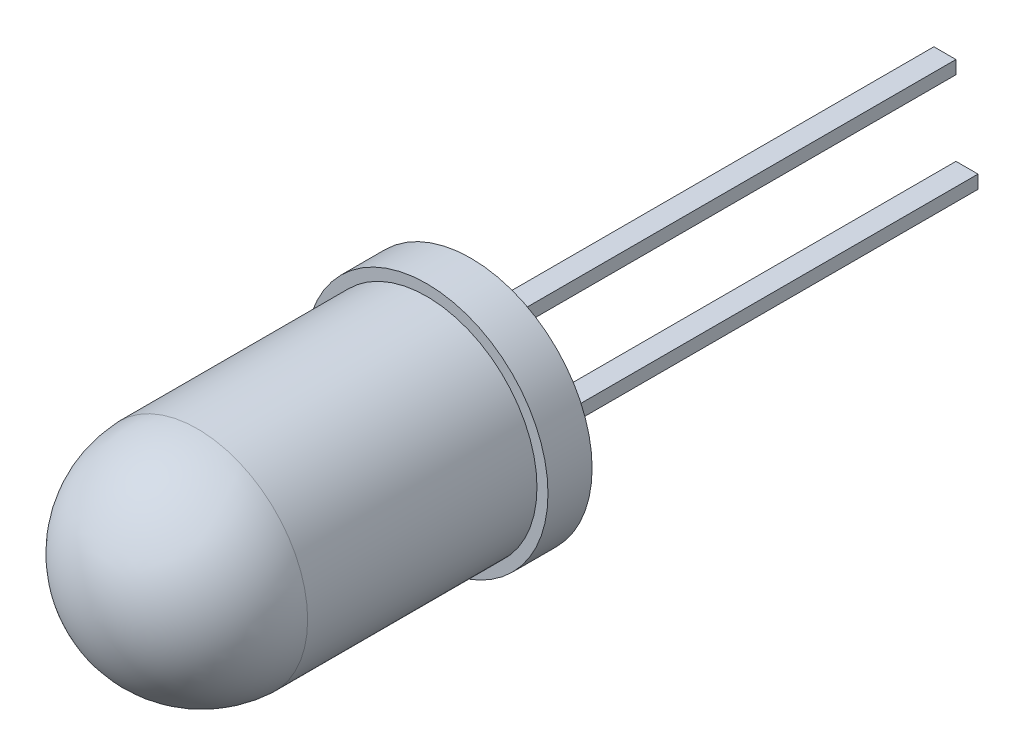
ISO-10303-21;
HEADER;
FILE_DESCRIPTION(('STEP AP214'),'2;1');
FILE_NAME('part.step','',(''),(''),'','','');
FILE_SCHEMA(('AUTOMOTIVE_DESIGN { 1 0 10303 214 1 1 1 1 }'));
ENDSEC;
DATA;
#1=APPLICATION_CONTEXT('core data for automotive mechanical design processes');
#2=APPLICATION_PROTOCOL_DEFINITION('international standard','automotive_design',2000,#1);
#3=PRODUCT_CONTEXT('',#1,'mechanical');
#4=PRODUCT('Part','Part','',(#3));
#5=PRODUCT_RELATED_PRODUCT_CATEGORY('part','',(#4));
#6=PRODUCT_DEFINITION_FORMATION('','',#4);
#7=PRODUCT_DEFINITION_CONTEXT('part definition',#1,'design');
#8=PRODUCT_DEFINITION('design','',#6,#7);
#9=PRODUCT_DEFINITION_SHAPE('','',#8);
#10=(LENGTH_UNIT() NAMED_UNIT(*) SI_UNIT(.MILLI.,.METRE.));
#11=(NAMED_UNIT(*) PLANE_ANGLE_UNIT() SI_UNIT($,.RADIAN.));
#12=(NAMED_UNIT(*) SI_UNIT($,.STERADIAN.) SOLID_ANGLE_UNIT());
#13=UNCERTAINTY_MEASURE_WITH_UNIT(LENGTH_MEASURE(1.E-05),#10,'distance_accuracy_value','');
#14=(GEOMETRIC_REPRESENTATION_CONTEXT(3) GLOBAL_UNCERTAINTY_ASSIGNED_CONTEXT((#13)) GLOBAL_UNIT_ASSIGNED_CONTEXT((#10,
#11,#12)) REPRESENTATION_CONTEXT('',''));
#15=CARTESIAN_POINT('',(0.,0.,0.));
#16=DIRECTION('',(0.,0.,1.));
#17=DIRECTION('',(1.,0.,0.));
#18=AXIS2_PLACEMENT_3D('',#15,#16,#17);
#19=CARTESIAN_POINT('',(0.,0.,2.6));
#20=DIRECTION('',(0.,0.,-1.));
#21=DIRECTION('',(-1.,0.,0.));
#22=AXIS2_PLACEMENT_3D('',#19,#20,#21);
#23=CYLINDRICAL_SURFACE('',#22,2.5);
#24=CARTESIAN_POINT('',(0.,0.,2.6));
#25=DIRECTION('',(0.,0.,1.));
#26=DIRECTION('',(1.,0.,0.));
#27=AXIS2_PLACEMENT_3D('',#24,#25,#26);
#28=CIRCLE('',#27,2.5);
#29=CARTESIAN_POINT('',(2.5,0.,2.6));
#30=VERTEX_POINT('',#29);
#31=EDGE_CURVE('E11',#30,#30,#28,.T.);
#32=ORIENTED_EDGE('',*,*,#31,.F.);
#33=EDGE_LOOP('',(#32));
#34=FACE_BOUND('',#33,.T.);
#35=CARTESIAN_POINT('',(0.,0.,-2.6));
#36=DIRECTION('',(0.,0.,1.));
#37=DIRECTION('',(1.,0.,0.));
#38=AXIS2_PLACEMENT_3D('',#35,#36,#37);
#39=CIRCLE('',#38,2.5);
#40=CARTESIAN_POINT('',(2.5,0.,-2.6));
#41=VERTEX_POINT('',#40);
#42=EDGE_CURVE('E48',#41,#41,#39,.T.);
#43=ORIENTED_EDGE('',*,*,#42,.T.);
#44=EDGE_LOOP('',(#43));
#45=FACE_BOUND('',#44,.T.);
#46=ADVANCED_FACE('F40',(#34,#45),#23,.T.);
#47=CARTESIAN_POINT('',(0.,0.,2.49791666666667));
#48=DIRECTION('',(0.,0.,1.));
#49=DIRECTION('',(1.,0.,0.));
#50=AXIS2_PLACEMENT_3D('',#47,#48,#49);
#51=SPHERICAL_SURFACE('',#50,2.50208333333333);
#52=ORIENTED_EDGE('',*,*,#31,.T.);
#53=EDGE_LOOP('',(#52));
#54=FACE_BOUND('',#53,.T.);
#55=ADVANCED_FACE('F42',(#54),#51,.T.);
#56=CARTESIAN_POINT('',(0.,0.,-3.6));
#57=DIRECTION('',(0.,0.,1.));
#58=DIRECTION('',(1.,0.,0.));
#59=AXIS2_PLACEMENT_3D('',#56,#57,#58);
#60=CYLINDRICAL_SURFACE('',#59,2.75);
#61=CARTESIAN_POINT('',(0.,0.,-3.6));
#62=DIRECTION('',(0.,0.,1.));
#63=DIRECTION('',(1.,0.,0.));
#64=AXIS2_PLACEMENT_3D('',#61,#62,#63);
#65=CIRCLE('',#64,2.75);
#66=CARTESIAN_POINT('',(2.75,0.,-3.6));
#67=VERTEX_POINT('',#66);
#68=EDGE_CURVE('E132',#67,#67,#65,.T.);
#69=ORIENTED_EDGE('',*,*,#68,.T.);
#70=EDGE_LOOP('',(#69));
#71=FACE_BOUND('',#70,.T.);
#72=CARTESIAN_POINT('',(0.,0.,-2.6));
#73=DIRECTION('',(0.,0.,1.));
#74=DIRECTION('',(1.,0.,0.));
#75=AXIS2_PLACEMENT_3D('',#72,#73,#74);
#76=CIRCLE('',#75,2.75);
#77=CARTESIAN_POINT('',(2.75,0.,-2.6));
#78=VERTEX_POINT('',#77);
#79=EDGE_CURVE('E125',#78,#78,#76,.T.);
#80=ORIENTED_EDGE('',*,*,#79,.F.);
#81=EDGE_LOOP('',(#80));
#82=FACE_BOUND('',#81,.T.);
#83=ADVANCED_FACE('F148',(#71,#82),#60,.T.);
#84=CARTESIAN_POINT('',(0.,0.,-3.6));
#85=DIRECTION('',(0.,0.,1.));
#86=DIRECTION('',(1.,0.,0.));
#87=AXIS2_PLACEMENT_3D('',#84,#85,#86);
#88=PLANE('',#87);
#89=DIRECTION('',(0.,-1.,0.));
#90=VECTOR('',#89,1.);
#91=CARTESIAN_POINT('',(-1.5,0.,-3.6));
#92=LINE('',#91,#90);
#93=CARTESIAN_POINT('',(-1.5,0.15,-3.6));
#94=VERTEX_POINT('',#93);
#95=CARTESIAN_POINT('',(-1.5,-0.15,-3.6));
#96=VERTEX_POINT('',#95);
#97=EDGE_CURVE('E287',#94,#96,#92,.T.);
#98=ORIENTED_EDGE('',*,*,#97,.T.);
#99=DIRECTION('',(1.,0.,0.));
#100=VECTOR('',#99,1.);
#101=CARTESIAN_POINT('',(0.,-0.15,-3.6));
#102=LINE('',#101,#100);
#103=CARTESIAN_POINT('',(-1.,-0.15,-3.6));
#104=VERTEX_POINT('',#103);
#105=EDGE_CURVE('E276',#96,#104,#102,.T.);
#106=ORIENTED_EDGE('',*,*,#105,.T.);
#107=DIRECTION('',(0.,1.,0.));
#108=VECTOR('',#107,1.);
#109=CARTESIAN_POINT('',(-1.,0.,-3.6));
#110=LINE('',#109,#108);
#111=CARTESIAN_POINT('',(-1.,0.15,-3.6));
#112=VERTEX_POINT('',#111);
#113=EDGE_CURVE('E279',#104,#112,#110,.T.);
#114=ORIENTED_EDGE('',*,*,#113,.T.);
#115=DIRECTION('',(-1.,0.,0.));
#116=VECTOR('',#115,1.);
#117=CARTESIAN_POINT('',(0.,0.15,-3.6));
#118=LINE('',#117,#116);
#119=EDGE_CURVE('E63',#112,#94,#118,.T.);
#120=ORIENTED_EDGE('',*,*,#119,.T.);
#121=EDGE_LOOP('',(#98,#106,#114,#120));
#122=FACE_BOUND('',#121,.T.);
#123=DIRECTION('',(0.,-1.,0.));
#124=VECTOR('',#123,1.);
#125=CARTESIAN_POINT('',(1.,0.,-3.6));
#126=LINE('',#125,#124);
#127=CARTESIAN_POINT('',(1.,0.15,-3.6));
#128=VERTEX_POINT('',#127);
#129=CARTESIAN_POINT('',(1.,-0.15,-3.6));
#130=VERTEX_POINT('',#129);
#131=EDGE_CURVE('E121',#128,#130,#126,.T.);
#132=ORIENTED_EDGE('',*,*,#131,.T.);
#133=DIRECTION('',(1.,0.,0.));
#134=VECTOR('',#133,1.);
#135=CARTESIAN_POINT('',(0.,-0.15,-3.6));
#136=LINE('',#135,#134);
#137=CARTESIAN_POINT('',(1.5,-0.15,-3.6));
#138=VERTEX_POINT('',#137);
#139=EDGE_CURVE('E304',#130,#138,#136,.T.);
#140=ORIENTED_EDGE('',*,*,#139,.T.);
#141=DIRECTION('',(0.,1.,0.));
#142=VECTOR('',#141,1.);
#143=CARTESIAN_POINT('',(1.5,0.,-3.6));
#144=LINE('',#143,#142);
#145=CARTESIAN_POINT('',(1.5,0.15,-3.6));
#146=VERTEX_POINT('',#145);
#147=EDGE_CURVE('E312',#138,#146,#144,.T.);
#148=ORIENTED_EDGE('',*,*,#147,.T.);
#149=DIRECTION('',(-1.,0.,0.));
#150=VECTOR('',#149,1.);
#151=CARTESIAN_POINT('',(0.,0.15,-3.6));
#152=LINE('',#151,#150);
#153=EDGE_CURVE('E315',#146,#128,#152,.T.);
#154=ORIENTED_EDGE('',*,*,#153,.T.);
#155=EDGE_LOOP('',(#132,#140,#148,#154));
#156=FACE_BOUND('',#155,.T.);
#157=ORIENTED_EDGE('',*,*,#68,.F.);
#158=EDGE_LOOP('',(#157));
#159=FACE_BOUND('',#158,.T.);
#160=ADVANCED_FACE('F144',(#122,#156,#159),#88,.F.);
#161=CARTESIAN_POINT('',(0.,0.,-2.6));
#162=DIRECTION('',(0.,0.,1.));
#163=DIRECTION('',(1.,0.,0.));
#164=AXIS2_PLACEMENT_3D('',#161,#162,#163);
#165=PLANE('',#164);
#166=ORIENTED_EDGE('',*,*,#42,.F.);
#167=EDGE_LOOP('',(#166));
#168=FACE_BOUND('',#167,.T.);
#169=ORIENTED_EDGE('',*,*,#79,.T.);
#170=EDGE_LOOP('',(#169));
#171=FACE_BOUND('',#170,.T.);
#172=ADVANCED_FACE('F140',(#168,#171),#165,.T.);
#173=CARTESIAN_POINT('',(0.,-0.15,-15.6));
#174=DIRECTION('',(0.,-1.,0.));
#175=DIRECTION('',(1.,0.,0.));
#176=AXIS2_PLACEMENT_3D('',#173,#174,#175);
#177=PLANE('',#176);
#178=DIRECTION('',(1.,0.,0.));
#179=VECTOR('',#178,1.);
#180=CARTESIAN_POINT('',(0.,-0.15,-13.6));
#181=LINE('',#180,#179);
#182=CARTESIAN_POINT('',(1.,-0.15,-13.6));
#183=VERTEX_POINT('',#182);
#184=CARTESIAN_POINT('',(1.5,-0.15,-13.6));
#185=VERTEX_POINT('',#184);
#186=EDGE_CURVE('E106',#183,#185,#181,.T.);
#187=ORIENTED_EDGE('',*,*,#186,.T.);
#188=DIRECTION('',(0.,0.,1.));
#189=VECTOR('',#188,1.);
#190=CARTESIAN_POINT('',(1.5,-0.15,-15.6));
#191=LINE('',#190,#189);
#192=EDGE_CURVE('E127',#185,#138,#191,.T.);
#193=ORIENTED_EDGE('',*,*,#192,.T.);
#194=ORIENTED_EDGE('',*,*,#139,.F.);
#195=DIRECTION('',(0.,0.,1.));
#196=VECTOR('',#195,1.);
#197=CARTESIAN_POINT('',(1.,-0.15,-15.6));
#198=LINE('',#197,#196);
#199=EDGE_CURVE('E123',#183,#130,#198,.T.);
#200=ORIENTED_EDGE('',*,*,#199,.F.);
#201=EDGE_LOOP('',(#187,#193,#194,#200));
#202=FACE_BOUND('',#201,.T.);
#203=ADVANCED_FACE('F143',(#202),#177,.T.);
#204=CARTESIAN_POINT('',(1.,0.,-15.6));
#205=DIRECTION('',(-1.,0.,0.));
#206=DIRECTION('',(0.,0.,1.));
#207=AXIS2_PLACEMENT_3D('',#204,#205,#206);
#208=PLANE('',#207);
#209=DIRECTION('',(0.,-1.,0.));
#210=VECTOR('',#209,1.);
#211=CARTESIAN_POINT('',(1.,0.,-13.6));
#212=LINE('',#211,#210);
#213=CARTESIAN_POINT('',(1.,0.15,-13.6));
#214=VERTEX_POINT('',#213);
#215=EDGE_CURVE('E103',#214,#183,#212,.T.);
#216=ORIENTED_EDGE('',*,*,#215,.T.);
#217=ORIENTED_EDGE('',*,*,#199,.T.);
#218=ORIENTED_EDGE('',*,*,#131,.F.);
#219=DIRECTION('',(0.,0.,1.));
#220=VECTOR('',#219,1.);
#221=CARTESIAN_POINT('',(1.,0.15,-15.6));
#222=LINE('',#221,#220);
#223=EDGE_CURVE('E115',#214,#128,#222,.T.);
#224=ORIENTED_EDGE('',*,*,#223,.F.);
#225=EDGE_LOOP('',(#216,#217,#218,#224));
#226=FACE_BOUND('',#225,.T.);
#227=ADVANCED_FACE('F119',(#226),#208,.T.);
#228=CARTESIAN_POINT('',(0.,0.15,-15.6));
#229=DIRECTION('',(0.,1.,0.));
#230=DIRECTION('',(-1.,0.,0.));
#231=AXIS2_PLACEMENT_3D('',#228,#229,#230);
#232=PLANE('',#231);
#233=DIRECTION('',(-1.,0.,0.));
#234=VECTOR('',#233,1.);
#235=CARTESIAN_POINT('',(0.,0.15,-13.6));
#236=LINE('',#235,#234);
#237=CARTESIAN_POINT('',(1.5,0.15,-13.6));
#238=VERTEX_POINT('',#237);
#239=EDGE_CURVE('E55',#238,#214,#236,.T.);
#240=ORIENTED_EDGE('',*,*,#239,.T.);
#241=ORIENTED_EDGE('',*,*,#223,.T.);
#242=ORIENTED_EDGE('',*,*,#153,.F.);
#243=DIRECTION('',(0.,0.,1.));
#244=VECTOR('',#243,1.);
#245=CARTESIAN_POINT('',(1.5,0.15,-15.6));
#246=LINE('',#245,#244);
#247=EDGE_CURVE('E117',#238,#146,#246,.T.);
#248=ORIENTED_EDGE('',*,*,#247,.F.);
#249=EDGE_LOOP('',(#240,#241,#242,#248));
#250=FACE_BOUND('',#249,.T.);
#251=ADVANCED_FACE('F113',(#250),#232,.T.);
#252=CARTESIAN_POINT('',(1.5,0.,-15.6));
#253=DIRECTION('',(1.,0.,0.));
#254=DIRECTION('',(0.,0.,-1.));
#255=AXIS2_PLACEMENT_3D('',#252,#253,#254);
#256=PLANE('',#255);
#257=DIRECTION('',(0.,1.,0.));
#258=VECTOR('',#257,1.);
#259=CARTESIAN_POINT('',(1.5,0.,-13.6));
#260=LINE('',#259,#258);
#261=EDGE_CURVE('E274',#185,#238,#260,.T.);
#262=ORIENTED_EDGE('',*,*,#261,.T.);
#263=ORIENTED_EDGE('',*,*,#247,.T.);
#264=ORIENTED_EDGE('',*,*,#147,.F.);
#265=ORIENTED_EDGE('',*,*,#192,.F.);
#266=EDGE_LOOP('',(#262,#263,#264,#265));
#267=FACE_BOUND('',#266,.T.);
#268=ADVANCED_FACE('F189',(#267),#256,.T.);
#269=CARTESIAN_POINT('',(0.,-0.15,-15.6));
#270=DIRECTION('',(0.,-1.,0.));
#271=DIRECTION('',(1.,0.,0.));
#272=AXIS2_PLACEMENT_3D('',#269,#270,#271);
#273=PLANE('',#272);
#274=ORIENTED_EDGE('',*,*,#105,.F.);
#275=DIRECTION('',(0.,0.,1.));
#276=VECTOR('',#275,1.);
#277=CARTESIAN_POINT('',(-1.5,-0.15,-15.6));
#278=LINE('',#277,#276);
#279=CARTESIAN_POINT('',(-1.5,-0.15,-15.6));
#280=VERTEX_POINT('',#279);
#281=EDGE_CURVE('E302',#280,#96,#278,.T.);
#282=ORIENTED_EDGE('',*,*,#281,.F.);
#283=DIRECTION('',(1.,0.,0.));
#284=VECTOR('',#283,1.);
#285=CARTESIAN_POINT('',(0.,-0.15,-15.6));
#286=LINE('',#285,#284);
#287=CARTESIAN_POINT('',(-1.,-0.15,-15.6));
#288=VERTEX_POINT('',#287);
#289=EDGE_CURVE('E283',#280,#288,#286,.T.);
#290=ORIENTED_EDGE('',*,*,#289,.T.);
#291=DIRECTION('',(0.,0.,1.));
#292=VECTOR('',#291,1.);
#293=CARTESIAN_POINT('',(-1.,-0.15,-15.6));
#294=LINE('',#293,#292);
#295=EDGE_CURVE('E295',#288,#104,#294,.T.);
#296=ORIENTED_EDGE('',*,*,#295,.T.);
#297=EDGE_LOOP('',(#274,#282,#290,#296));
#298=FACE_BOUND('',#297,.T.);
#299=ADVANCED_FACE('F183',(#298),#273,.T.);
#300=CARTESIAN_POINT('',(-1.5,0.,-15.6));
#301=DIRECTION('',(-1.,0.,0.));
#302=DIRECTION('',(0.,0.,1.));
#303=AXIS2_PLACEMENT_3D('',#300,#301,#302);
#304=PLANE('',#303);
#305=ORIENTED_EDGE('',*,*,#97,.F.);
#306=DIRECTION('',(0.,0.,1.));
#307=VECTOR('',#306,1.);
#308=CARTESIAN_POINT('',(-1.5,0.15,-15.6));
#309=LINE('',#308,#307);
#310=CARTESIAN_POINT('',(-1.5,0.15,-15.6));
#311=VERTEX_POINT('',#310);
#312=EDGE_CURVE('E305',#311,#94,#309,.T.);
#313=ORIENTED_EDGE('',*,*,#312,.F.);
#314=DIRECTION('',(0.,-1.,0.));
#315=VECTOR('',#314,1.);
#316=CARTESIAN_POINT('',(-1.5,0.,-15.6));
#317=LINE('',#316,#315);
#318=EDGE_CURVE('E293',#311,#280,#317,.T.);
#319=ORIENTED_EDGE('',*,*,#318,.T.);
#320=ORIENTED_EDGE('',*,*,#281,.T.);
#321=EDGE_LOOP('',(#305,#313,#319,#320));
#322=FACE_BOUND('',#321,.T.);
#323=ADVANCED_FACE('F188',(#322),#304,.T.);
#324=CARTESIAN_POINT('',(0.,0.15,-15.6));
#325=DIRECTION('',(0.,1.,0.));
#326=DIRECTION('',(-1.,0.,0.));
#327=AXIS2_PLACEMENT_3D('',#324,#325,#326);
#328=PLANE('',#327);
#329=ORIENTED_EDGE('',*,*,#119,.F.);
#330=DIRECTION('',(0.,0.,1.));
#331=VECTOR('',#330,1.);
#332=CARTESIAN_POINT('',(-1.,0.15,-15.6));
#333=LINE('',#332,#331);
#334=CARTESIAN_POINT('',(-1.,0.15,-15.6));
#335=VERTEX_POINT('',#334);
#336=EDGE_CURVE('E307',#335,#112,#333,.T.);
#337=ORIENTED_EDGE('',*,*,#336,.F.);
#338=DIRECTION('',(-1.,0.,0.));
#339=VECTOR('',#338,1.);
#340=CARTESIAN_POINT('',(0.,0.15,-15.6));
#341=LINE('',#340,#339);
#342=EDGE_CURVE('E290',#335,#311,#341,.T.);
#343=ORIENTED_EDGE('',*,*,#342,.T.);
#344=ORIENTED_EDGE('',*,*,#312,.T.);
#345=EDGE_LOOP('',(#329,#337,#343,#344));
#346=FACE_BOUND('',#345,.T.);
#347=ADVANCED_FACE('F201',(#346),#328,.T.);
#348=CARTESIAN_POINT('',(-1.,0.,-15.6));
#349=DIRECTION('',(1.,0.,0.));
#350=DIRECTION('',(0.,0.,-1.));
#351=AXIS2_PLACEMENT_3D('',#348,#349,#350);
#352=PLANE('',#351);
#353=ORIENTED_EDGE('',*,*,#113,.F.);
#354=ORIENTED_EDGE('',*,*,#295,.F.);
#355=DIRECTION('',(0.,1.,0.));
#356=VECTOR('',#355,1.);
#357=CARTESIAN_POINT('',(-1.,0.,-15.6));
#358=LINE('',#357,#356);
#359=EDGE_CURVE('E286',#288,#335,#358,.T.);
#360=ORIENTED_EDGE('',*,*,#359,.T.);
#361=ORIENTED_EDGE('',*,*,#336,.T.);
#362=EDGE_LOOP('',(#353,#354,#360,#361));
#363=FACE_BOUND('',#362,.T.);
#364=ADVANCED_FACE('F211',(#363),#352,.T.);
#365=CARTESIAN_POINT('',(0.,0.,-15.6));
#366=DIRECTION('',(0.,0.,1.));
#367=DIRECTION('',(1.,0.,0.));
#368=AXIS2_PLACEMENT_3D('',#365,#366,#367);
#369=PLANE('',#368);
#370=ORIENTED_EDGE('',*,*,#289,.F.);
#371=ORIENTED_EDGE('',*,*,#318,.F.);
#372=ORIENTED_EDGE('',*,*,#342,.F.);
#373=ORIENTED_EDGE('',*,*,#359,.F.);
#374=EDGE_LOOP('',(#370,#371,#372,#373));
#375=FACE_BOUND('',#374,.T.);
#376=ADVANCED_FACE('F220',(#375),#369,.F.);
#377=CARTESIAN_POINT('',(0.,0.,-13.6));
#378=DIRECTION('',(0.,0.,1.));
#379=DIRECTION('',(1.,0.,0.));
#380=AXIS2_PLACEMENT_3D('',#377,#378,#379);
#381=PLANE('',#380);
#382=ORIENTED_EDGE('',*,*,#239,.F.);
#383=ORIENTED_EDGE('',*,*,#261,.F.);
#384=ORIENTED_EDGE('',*,*,#186,.F.);
#385=ORIENTED_EDGE('',*,*,#215,.F.);
#386=EDGE_LOOP('',(#382,#383,#384,#385));
#387=FACE_BOUND('',#386,.T.);
#388=ADVANCED_FACE('F104',(#387),#381,.F.);
#389=CLOSED_SHELL('',(#46,#55,#83,#160,#172,#203,#227,#251,#268,#299,#323,#347,#364,#376,#388));
#390=MANIFOLD_SOLID_BREP('B2',#389);
#391=ADVANCED_BREP_SHAPE_REPRESENTATION('',(#18,#390),#14);
#392=SHAPE_DEFINITION_REPRESENTATION(#9,#391);
ENDSEC;
END-ISO-10303-21;
